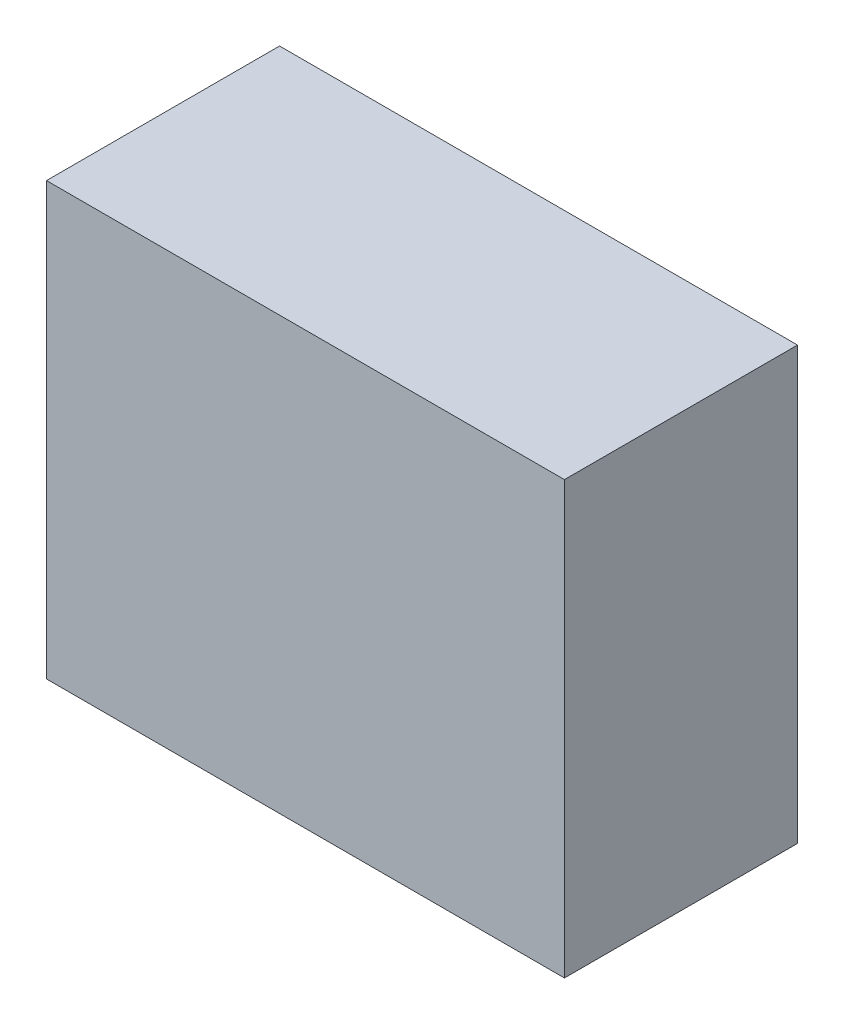
ISO-10303-21;
HEADER;
FILE_DESCRIPTION(('STEP AP214'),'2;1');
FILE_NAME('part.step','',(''),(''),'','','');
FILE_SCHEMA(('AUTOMOTIVE_DESIGN { 1 0 10303 214 1 1 1 1 }'));
ENDSEC;
DATA;
#1=APPLICATION_CONTEXT('core data for automotive mechanical design processes');
#2=APPLICATION_PROTOCOL_DEFINITION('international standard','automotive_design',2000,#1);
#3=PRODUCT_CONTEXT('',#1,'mechanical');
#4=PRODUCT('Part','Part','',(#3));
#5=PRODUCT_RELATED_PRODUCT_CATEGORY('part','',(#4));
#6=PRODUCT_DEFINITION_FORMATION('','',#4);
#7=PRODUCT_DEFINITION_CONTEXT('part definition',#1,'design');
#8=PRODUCT_DEFINITION('design','',#6,#7);
#9=PRODUCT_DEFINITION_SHAPE('','',#8);
#10=(LENGTH_UNIT() NAMED_UNIT(*) SI_UNIT(.MILLI.,.METRE.));
#11=(NAMED_UNIT(*) PLANE_ANGLE_UNIT() SI_UNIT($,.RADIAN.));
#12=(NAMED_UNIT(*) SI_UNIT($,.STERADIAN.) SOLID_ANGLE_UNIT());
#13=UNCERTAINTY_MEASURE_WITH_UNIT(LENGTH_MEASURE(1.E-05),#10,'distance_accuracy_value','');
#14=(GEOMETRIC_REPRESENTATION_CONTEXT(3) GLOBAL_UNCERTAINTY_ASSIGNED_CONTEXT((#13)) GLOBAL_UNIT_ASSIGNED_CONTEXT((#10,
#11,#12)) REPRESENTATION_CONTEXT('',''));
#15=CARTESIAN_POINT('',(0.,0.,0.));
#16=DIRECTION('',(0.,0.,1.));
#17=DIRECTION('',(1.,0.,0.));
#18=AXIS2_PLACEMENT_3D('',#15,#16,#17);
#19=CARTESIAN_POINT('',(0.,0.,1.34999984));
#20=DIRECTION('',(0.,0.,1.));
#21=DIRECTION('',(1.,0.,0.));
#22=AXIS2_PLACEMENT_3D('',#19,#20,#21);
#23=PLANE('',#22);
#24=DIRECTION('',(0.,1.,0.));
#25=VECTOR('',#24,1.);
#26=CARTESIAN_POINT('',(1.49999954,-1.25000004,1.34999984));
#27=LINE('',#26,#25);
#28=CARTESIAN_POINT('',(1.49999954,-1.25000004,1.34999984));
#29=VERTEX_POINT('',#28);
#30=CARTESIAN_POINT('',(1.49999954,1.25000004,1.34999984));
#31=VERTEX_POINT('',#30);
#32=EDGE_CURVE('E92',#29,#31,#27,.T.);
#33=ORIENTED_EDGE('',*,*,#32,.T.);
#34=DIRECTION('',(-1.,0.,0.));
#35=VECTOR('',#34,1.);
#36=CARTESIAN_POINT('',(1.49999954,1.25000004,1.34999984));
#37=LINE('',#36,#35);
#38=CARTESIAN_POINT('',(-1.49999954,1.25000004,1.34999984));
#39=VERTEX_POINT('',#38);
#40=EDGE_CURVE('E71',#31,#39,#37,.T.);
#41=ORIENTED_EDGE('',*,*,#40,.T.);
#42=DIRECTION('',(0.,-1.,0.));
#43=VECTOR('',#42,1.);
#44=CARTESIAN_POINT('',(-1.49999954,1.25000004,1.34999984));
#45=LINE('',#44,#43);
#46=CARTESIAN_POINT('',(-1.49999954,-1.25000004,1.34999984));
#47=VERTEX_POINT('',#46);
#48=EDGE_CURVE('E76',#39,#47,#45,.T.);
#49=ORIENTED_EDGE('',*,*,#48,.T.);
#50=DIRECTION('',(1.,0.,0.));
#51=VECTOR('',#50,1.);
#52=CARTESIAN_POINT('',(-1.49999954,-1.25000004,1.34999984));
#53=LINE('',#52,#51);
#54=EDGE_CURVE('E11',#47,#29,#53,.T.);
#55=ORIENTED_EDGE('',*,*,#54,.T.);
#56=EDGE_LOOP('',(#33,#41,#49,#55));
#57=FACE_BOUND('',#56,.T.);
#58=ADVANCED_FACE('F17',(#57),#23,.T.);
#59=CARTESIAN_POINT('',(0.,0.,0.));
#60=DIRECTION('',(0.,0.,1.));
#61=DIRECTION('',(1.,0.,0.));
#62=AXIS2_PLACEMENT_3D('',#59,#60,#61);
#63=PLANE('',#62);
#64=DIRECTION('',(1.,0.,0.));
#65=VECTOR('',#64,1.);
#66=CARTESIAN_POINT('',(-1.49999954,-1.25000004,0.));
#67=LINE('',#66,#65);
#68=CARTESIAN_POINT('',(-1.49999954,-1.25000004,0.));
#69=VERTEX_POINT('',#68);
#70=CARTESIAN_POINT('',(1.49999954,-1.25000004,0.));
#71=VERTEX_POINT('',#70);
#72=EDGE_CURVE('E25',#69,#71,#67,.T.);
#73=ORIENTED_EDGE('',*,*,#72,.F.);
#74=DIRECTION('',(0.,-1.,0.));
#75=VECTOR('',#74,1.);
#76=CARTESIAN_POINT('',(-1.49999954,1.25000004,0.));
#77=LINE('',#76,#75);
#78=CARTESIAN_POINT('',(-1.49999954,1.25000004,0.));
#79=VERTEX_POINT('',#78);
#80=EDGE_CURVE('E60',#79,#69,#77,.T.);
#81=ORIENTED_EDGE('',*,*,#80,.F.);
#82=DIRECTION('',(-1.,0.,0.));
#83=VECTOR('',#82,1.);
#84=CARTESIAN_POINT('',(1.49999954,1.25000004,0.));
#85=LINE('',#84,#83);
#86=CARTESIAN_POINT('',(1.49999954,1.25000004,0.));
#87=VERTEX_POINT('',#86);
#88=EDGE_CURVE('E65',#87,#79,#85,.T.);
#89=ORIENTED_EDGE('',*,*,#88,.F.);
#90=DIRECTION('',(0.,1.,0.));
#91=VECTOR('',#90,1.);
#92=CARTESIAN_POINT('',(1.49999954,-1.25000004,0.));
#93=LINE('',#92,#91);
#94=EDGE_CURVE('E111',#71,#87,#93,.T.);
#95=ORIENTED_EDGE('',*,*,#94,.F.);
#96=EDGE_LOOP('',(#73,#81,#89,#95));
#97=FACE_BOUND('',#96,.T.);
#98=ADVANCED_FACE('F62',(#97),#63,.F.);
#99=CARTESIAN_POINT('',(-1.49999954,-1.25000004,0.));
#100=DIRECTION('',(0.,1.,0.));
#101=DIRECTION('',(1.,0.,0.));
#102=AXIS2_PLACEMENT_3D('',#99,#100,#101);
#103=PLANE('',#102);
#104=ORIENTED_EDGE('',*,*,#72,.T.);
#105=DIRECTION('',(0.,0.,1.));
#106=VECTOR('',#105,1.);
#107=CARTESIAN_POINT('',(1.49999954,-1.25000004,0.));
#108=LINE('',#107,#106);
#109=EDGE_CURVE('E87',#71,#29,#108,.T.);
#110=ORIENTED_EDGE('',*,*,#109,.T.);
#111=ORIENTED_EDGE('',*,*,#54,.F.);
#112=DIRECTION('',(0.,0.,1.));
#113=VECTOR('',#112,1.);
#114=CARTESIAN_POINT('',(-1.49999954,-1.25000004,0.));
#115=LINE('',#114,#113);
#116=EDGE_CURVE('E70',#69,#47,#115,.T.);
#117=ORIENTED_EDGE('',*,*,#116,.F.);
#118=EDGE_LOOP('',(#104,#110,#111,#117));
#119=FACE_BOUND('',#118,.T.);
#120=ADVANCED_FACE('F130',(#119),#103,.F.);
#121=CARTESIAN_POINT('',(-1.49999954,1.25000004,0.));
#122=DIRECTION('',(1.,0.,0.));
#123=DIRECTION('',(0.,1.,0.));
#124=AXIS2_PLACEMENT_3D('',#121,#122,#123);
#125=PLANE('',#124);
#126=ORIENTED_EDGE('',*,*,#80,.T.);
#127=ORIENTED_EDGE('',*,*,#116,.T.);
#128=ORIENTED_EDGE('',*,*,#48,.F.);
#129=DIRECTION('',(0.,0.,1.));
#130=VECTOR('',#129,1.);
#131=CARTESIAN_POINT('',(-1.49999954,1.25000004,0.));
#132=LINE('',#131,#130);
#133=EDGE_CURVE('E74',#79,#39,#132,.T.);
#134=ORIENTED_EDGE('',*,*,#133,.F.);
#135=EDGE_LOOP('',(#126,#127,#128,#134));
#136=FACE_BOUND('',#135,.T.);
#137=ADVANCED_FACE('F75',(#136),#125,.F.);
#138=CARTESIAN_POINT('',(1.49999954,1.25000004,0.));
#139=DIRECTION('',(0.,-1.,0.));
#140=DIRECTION('',(0.,0.,-1.));
#141=AXIS2_PLACEMENT_3D('',#138,#139,#140);
#142=PLANE('',#141);
#143=ORIENTED_EDGE('',*,*,#88,.T.);
#144=ORIENTED_EDGE('',*,*,#133,.T.);
#145=ORIENTED_EDGE('',*,*,#40,.F.);
#146=DIRECTION('',(0.,0.,1.));
#147=VECTOR('',#146,1.);
#148=CARTESIAN_POINT('',(1.49999954,1.25000004,0.));
#149=LINE('',#148,#147);
#150=EDGE_CURVE('E84',#87,#31,#149,.T.);
#151=ORIENTED_EDGE('',*,*,#150,.F.);
#152=EDGE_LOOP('',(#143,#144,#145,#151));
#153=FACE_BOUND('',#152,.T.);
#154=ADVANCED_FACE('F82',(#153),#142,.F.);
#155=CARTESIAN_POINT('',(1.49999954,-1.25000004,0.));
#156=DIRECTION('',(-1.,0.,0.));
#157=DIRECTION('',(0.,0.,1.));
#158=AXIS2_PLACEMENT_3D('',#155,#156,#157);
#159=PLANE('',#158);
#160=ORIENTED_EDGE('',*,*,#94,.T.);
#161=ORIENTED_EDGE('',*,*,#150,.T.);
#162=ORIENTED_EDGE('',*,*,#32,.F.);
#163=ORIENTED_EDGE('',*,*,#109,.F.);
#164=EDGE_LOOP('',(#160,#161,#162,#163));
#165=FACE_BOUND('',#164,.T.);
#166=ADVANCED_FACE('F115',(#165),#159,.F.);
#167=CLOSED_SHELL('',(#58,#98,#120,#137,#154,#166));
#168=MANIFOLD_SOLID_BREP('B1',#167);
#169=ADVANCED_BREP_SHAPE_REPRESENTATION('',(#18,#168),#14);
#170=SHAPE_DEFINITION_REPRESENTATION(#9,#169);
ENDSEC;
END-ISO-10303-21;
